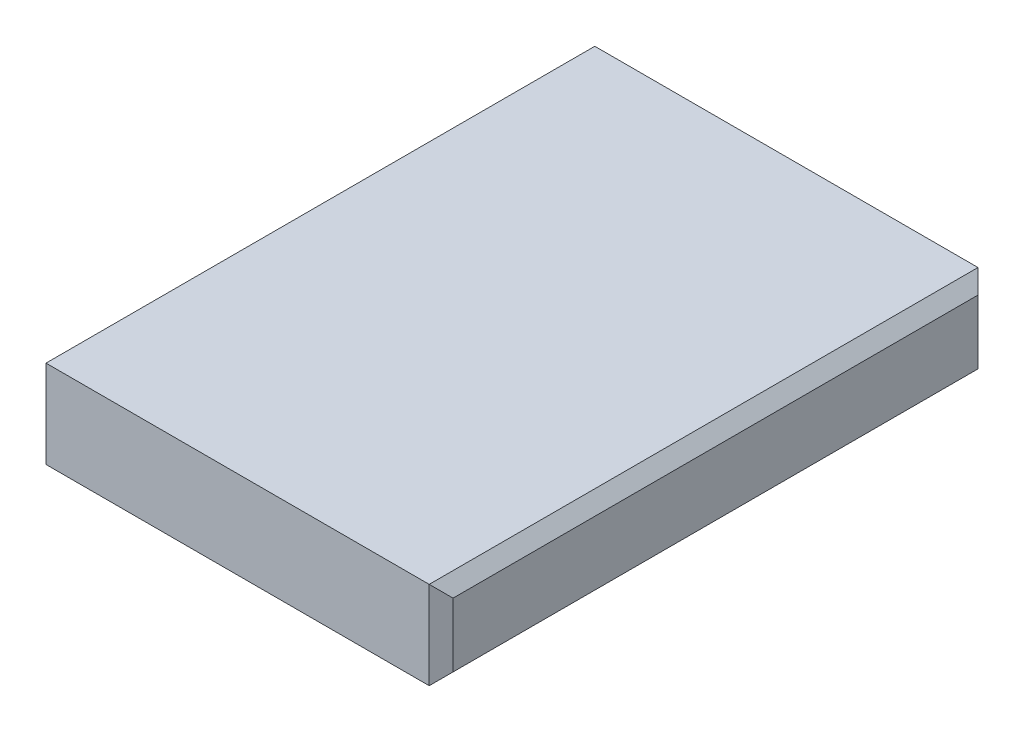
ISO-10303-21;
HEADER;
FILE_DESCRIPTION(('STEP AP214'),'2;1');
FILE_NAME('part.step','',(''),(''),'','','');
FILE_SCHEMA(('AUTOMOTIVE_DESIGN { 1 0 10303 214 1 1 1 1 }'));
ENDSEC;
DATA;
#1=APPLICATION_CONTEXT('core data for automotive mechanical design processes');
#2=APPLICATION_PROTOCOL_DEFINITION('international standard','automotive_design',2000,#1);
#3=PRODUCT_CONTEXT('',#1,'mechanical');
#4=PRODUCT('Part','Part','',(#3));
#5=PRODUCT_RELATED_PRODUCT_CATEGORY('part','',(#4));
#6=PRODUCT_DEFINITION_FORMATION('','',#4);
#7=PRODUCT_DEFINITION_CONTEXT('part definition',#1,'design');
#8=PRODUCT_DEFINITION('design','',#6,#7);
#9=PRODUCT_DEFINITION_SHAPE('','',#8);
#10=(LENGTH_UNIT() NAMED_UNIT(*) SI_UNIT(.MILLI.,.METRE.));
#11=(NAMED_UNIT(*) PLANE_ANGLE_UNIT() SI_UNIT($,.RADIAN.));
#12=(NAMED_UNIT(*) SI_UNIT($,.STERADIAN.) SOLID_ANGLE_UNIT());
#13=UNCERTAINTY_MEASURE_WITH_UNIT(LENGTH_MEASURE(1.E-05),#10,'distance_accuracy_value','');
#14=(GEOMETRIC_REPRESENTATION_CONTEXT(3) GLOBAL_UNCERTAINTY_ASSIGNED_CONTEXT((#13)) GLOBAL_UNIT_ASSIGNED_CONTEXT((#10,
#11,#12)) REPRESENTATION_CONTEXT('',''));
#15=CARTESIAN_POINT('',(0.,0.,0.));
#16=DIRECTION('',(0.,0.,1.));
#17=DIRECTION('',(1.,0.,0.));
#18=AXIS2_PLACEMENT_3D('',#15,#16,#17);
#19=CARTESIAN_POINT('',(35.4900000000119,15.85,-25.0210316449339));
#20=CARTESIAN_POINT('',(35.4900000000119,15.85,-12.9863304920074));
#21=CARTESIAN_POINT('',(35.4900000000119,12.507797657098,-25.0210316449339));
#22=CARTESIAN_POINT('',(35.4900000000119,12.507797657098,-12.9863304920074));
#23=(BOUNDED_SURFACE() B_SPLINE_SURFACE(1,1,((#19,#20),(#21,#22)),.UNSPECIFIED.,.F.,.F.,
.F.) B_SPLINE_SURFACE_WITH_KNOTS((2,2),(2,2),(0.,1.),(52.1634026604307,64.1981038133572),
.UNSPECIFIED.) GEOMETRIC_REPRESENTATION_ITEM() RATIONAL_B_SPLINE_SURFACE(((1.,1.),(1.,1.))) REPRESENTATION_ITEM('') SURFACE());
#24=CARTESIAN_POINT('',(35.4900000000119,15.125,-24.7499999999693));
#25=CARTESIAN_POINT('',(35.4900000000119,15.125,-13.2499999999696));
#26=(BOUNDED_CURVE() B_SPLINE_CURVE(1,(#24,#25),.UNSPECIFIED.,.F.,
.F.) B_SPLINE_CURVE_WITH_KNOTS((2,2),(0.,1.),
.UNSPECIFIED.) CURVE() GEOMETRIC_REPRESENTATION_ITEM() RATIONAL_B_SPLINE_CURVE((1.,1.)) REPRESENTATION_ITEM(''));
#27=CARTESIAN_POINT('',(35.4900000000119,15.125,-24.7499999999694));
#28=VERTEX_POINT('',#27);
#29=CARTESIAN_POINT('',(35.4900000000119,15.125,-13.2499999999696));
#30=VERTEX_POINT('',#29);
#31=EDGE_CURVE('E46',#28,#30,#26,.T.);
#32=CARTESIAN_POINT('',(35.4900000000119,13.285,-24.7499999999693));
#33=CARTESIAN_POINT('',(35.4900000000119,15.125,-24.7499999999693));
#34=(BOUNDED_CURVE() B_SPLINE_CURVE(1,(#32,#33),.UNSPECIFIED.,.F.,
.F.) B_SPLINE_CURVE_WITH_KNOTS((2,2),(0.,1.),
.UNSPECIFIED.) CURVE() GEOMETRIC_REPRESENTATION_ITEM() RATIONAL_B_SPLINE_CURVE((1.,1.)) REPRESENTATION_ITEM(''));
#35=CARTESIAN_POINT('',(35.4900000000119,13.285,-24.7499999999693));
#36=VERTEX_POINT('',#35);
#37=EDGE_CURVE('E11',#36,#28,#34,.T.);
#38=CARTESIAN_POINT('',(35.4900000000119,13.285,-13.2499999999696));
#39=CARTESIAN_POINT('',(35.4900000000119,13.285,-24.7499999999693));
#40=(BOUNDED_CURVE() B_SPLINE_CURVE(1,(#38,#39),.UNSPECIFIED.,.F.,
.F.) B_SPLINE_CURVE_WITH_KNOTS((2,2),(0.,1.),
.UNSPECIFIED.) CURVE() GEOMETRIC_REPRESENTATION_ITEM() RATIONAL_B_SPLINE_CURVE((1.,1.)) REPRESENTATION_ITEM(''));
#41=CARTESIAN_POINT('',(35.4900000000119,13.285,-13.2499999999696));
#42=VERTEX_POINT('',#41);
#43=EDGE_CURVE('E196',#42,#36,#40,.T.);
#44=CARTESIAN_POINT('',(35.4900000000119,15.125,-13.2499999999696));
#45=CARTESIAN_POINT('',(35.4900000000119,13.285,-13.2499999999696));
#46=(BOUNDED_CURVE() B_SPLINE_CURVE(1,(#44,#45),.UNSPECIFIED.,.F.,
.F.) B_SPLINE_CURVE_WITH_KNOTS((2,2),(0.,1.),
.UNSPECIFIED.) CURVE() GEOMETRIC_REPRESENTATION_ITEM() RATIONAL_B_SPLINE_CURVE((1.,1.)) REPRESENTATION_ITEM(''));
#47=EDGE_CURVE('E139',#30,#42,#46,.T.);
#48=ORIENTED_EDGE('',*,*,#31,.F.);
#49=ORIENTED_EDGE('',*,*,#37,.F.);
#50=ORIENTED_EDGE('',*,*,#43,.F.);
#51=ORIENTED_EDGE('',*,*,#47,.F.);
#52=EDGE_LOOP('',(#48,#49,#50,#51));
#53=FACE_BOUND('',#52,.T.);
#54=ADVANCED_FACE('F17',(#53),#23,.T.);
#55=CARTESIAN_POINT('',(43.5200000000117,13.285,-24.7499999999693));
#56=CARTESIAN_POINT('',(43.5200000000117,15.125,-24.7499999999693));
#57=CARTESIAN_POINT('',(35.4900000000119,13.285,-24.7499999999693));
#58=CARTESIAN_POINT('',(35.4900000000119,15.125,-24.7499999999693));
#59=(BOUNDED_SURFACE() B_SPLINE_SURFACE(1,1,((#55,#56),(#57,#58)),.UNSPECIFIED.,.F.,.F.,
.F.) B_SPLINE_SURFACE_WITH_KNOTS((2,2),(2,2),(0.0196217877432337,0.649873610055907),
(11.4999999999997,13.3399999999997),
.UNSPECIFIED.) GEOMETRIC_REPRESENTATION_ITEM() RATIONAL_B_SPLINE_SURFACE(((1.,1.),(1.,1.))) REPRESENTATION_ITEM('') SURFACE());
#60=CARTESIAN_POINT('',(43.5200000000117,15.125,-24.7499999999693));
#61=CARTESIAN_POINT('',(35.4900000000119,15.125,-24.7499999999693));
#62=(BOUNDED_CURVE() B_SPLINE_CURVE(1,(#60,#61),.UNSPECIFIED.,.F.,
.F.) B_SPLINE_CURVE_WITH_KNOTS((2,2),(0.0196217877432337,0.649873610055907),
.UNSPECIFIED.) CURVE() GEOMETRIC_REPRESENTATION_ITEM() RATIONAL_B_SPLINE_CURVE((1.,1.)) REPRESENTATION_ITEM(''));
#63=CARTESIAN_POINT('',(43.5200000000118,15.125,-24.7499999999693));
#64=VERTEX_POINT('',#63);
#65=EDGE_CURVE('E148',#64,#28,#62,.T.);
#66=CARTESIAN_POINT('',(43.5200000000117,13.285,-24.7499999999693));
#67=CARTESIAN_POINT('',(43.5200000000117,15.125,-24.7499999999693));
#68=(BOUNDED_CURVE() B_SPLINE_CURVE(1,(#66,#67),.UNSPECIFIED.,.F.,
.F.) B_SPLINE_CURVE_WITH_KNOTS((2,2),(0.249999999999931,0.749999999999932),
.UNSPECIFIED.) CURVE() GEOMETRIC_REPRESENTATION_ITEM() RATIONAL_B_SPLINE_CURVE((1.,1.)) REPRESENTATION_ITEM(''));
#69=CARTESIAN_POINT('',(43.5200000000118,13.285,-24.7499999999693));
#70=VERTEX_POINT('',#69);
#71=EDGE_CURVE('E132',#70,#64,#68,.T.);
#72=CARTESIAN_POINT('',(43.5200000000117,13.285,-24.7499999999693));
#73=CARTESIAN_POINT('',(35.4900000000119,13.285,-24.7499999999693));
#74=(BOUNDED_CURVE() B_SPLINE_CURVE(1,(#72,#73),.UNSPECIFIED.,.F.,
.F.) B_SPLINE_CURVE_WITH_KNOTS((2,2),(0.0196217877432337,0.649873610055907),
.UNSPECIFIED.) CURVE() GEOMETRIC_REPRESENTATION_ITEM() RATIONAL_B_SPLINE_CURVE((1.,1.)) REPRESENTATION_ITEM(''));
#75=EDGE_CURVE('E32',#70,#36,#74,.T.);
#76=ORIENTED_EDGE('',*,*,#37,.T.);
#77=ORIENTED_EDGE('',*,*,#65,.F.);
#78=ORIENTED_EDGE('',*,*,#71,.F.);
#79=ORIENTED_EDGE('',*,*,#75,.T.);
#80=EDGE_LOOP('',(#76,#77,#78,#79));
#81=FACE_BOUND('',#80,.T.);
#82=ADVANCED_FACE('F259',(#81),#59,.T.);
#83=CARTESIAN_POINT('',(43.5200000000117,15.125,-24.7499999999693));
#84=CARTESIAN_POINT('',(43.5200000000117,15.125,-13.2499999999696));
#85=CARTESIAN_POINT('',(35.4900000000119,15.125,-24.7499999999693));
#86=CARTESIAN_POINT('',(35.4900000000119,15.125,-13.2499999999696));
#87=(BOUNDED_SURFACE() B_SPLINE_SURFACE(1,1,((#83,#84),(#85,#86)),.UNSPECIFIED.,.F.,.F.,
.F.) B_SPLINE_SURFACE_WITH_KNOTS((2,2),(2,2),(0.0196217877432337,0.649873610055907),
(13.3399999999998,24.8399999999995),
.UNSPECIFIED.) GEOMETRIC_REPRESENTATION_ITEM() RATIONAL_B_SPLINE_SURFACE(((1.,1.),(1.,1.))) REPRESENTATION_ITEM('') SURFACE());
#88=CARTESIAN_POINT('',(43.5200000000117,15.125,-13.2499999999696));
#89=CARTESIAN_POINT('',(35.4900000000119,15.125,-13.2499999999696));
#90=(BOUNDED_CURVE() B_SPLINE_CURVE(1,(#88,#89),.UNSPECIFIED.,.F.,
.F.) B_SPLINE_CURVE_WITH_KNOTS((2,2),(0.0196217877432337,0.649873610055907),
.UNSPECIFIED.) CURVE() GEOMETRIC_REPRESENTATION_ITEM() RATIONAL_B_SPLINE_CURVE((1.,1.)) REPRESENTATION_ITEM(''));
#91=CARTESIAN_POINT('',(43.5200000000118,15.125,-13.2499999999696));
#92=VERTEX_POINT('',#91);
#93=EDGE_CURVE('E23',#92,#30,#90,.T.);
#94=CARTESIAN_POINT('',(43.5200000000117,15.125,-24.7499999999693));
#95=CARTESIAN_POINT('',(43.5200000000117,15.125,-13.2499999999696));
#96=(BOUNDED_CURVE() B_SPLINE_CURVE(1,(#94,#95),.UNSPECIFIED.,.F.,
.F.) B_SPLINE_CURVE_WITH_KNOTS((2,2),(0.249999999999989,0.749999999999978),
.UNSPECIFIED.) CURVE() GEOMETRIC_REPRESENTATION_ITEM() RATIONAL_B_SPLINE_CURVE((1.,1.)) REPRESENTATION_ITEM(''));
#97=EDGE_CURVE('E100',#64,#92,#96,.T.);
#98=ORIENTED_EDGE('',*,*,#31,.T.);
#99=ORIENTED_EDGE('',*,*,#93,.F.);
#100=ORIENTED_EDGE('',*,*,#97,.F.);
#101=ORIENTED_EDGE('',*,*,#65,.T.);
#102=EDGE_LOOP('',(#98,#99,#100,#101));
#103=FACE_BOUND('',#102,.T.);
#104=ADVANCED_FACE('F380',(#103),#87,.T.);
#105=CARTESIAN_POINT('',(43.5200000000117,15.125,-13.2499999999696));
#106=CARTESIAN_POINT('',(43.5200000000117,13.285,-13.2499999999696));
#107=CARTESIAN_POINT('',(35.4900000000119,15.125,-13.2499999999696));
#108=CARTESIAN_POINT('',(35.4900000000119,13.285,-13.2499999999696));
#109=(BOUNDED_SURFACE() B_SPLINE_SURFACE(1,1,((#105,#106),(#107,#108)),.UNSPECIFIED.,.F.,.F.,
.F.) B_SPLINE_SURFACE_WITH_KNOTS((2,2),(2,2),(0.0196217877432337,0.649873610055907),
(24.8399999999995,26.6799999999995),
.UNSPECIFIED.) GEOMETRIC_REPRESENTATION_ITEM() RATIONAL_B_SPLINE_SURFACE(((1.,1.),(1.,1.))) REPRESENTATION_ITEM('') SURFACE());
#110=CARTESIAN_POINT('',(43.5200000000117,13.285,-13.2499999999696));
#111=CARTESIAN_POINT('',(35.4900000000119,13.285,-13.2499999999696));
#112=(BOUNDED_CURVE() B_SPLINE_CURVE(1,(#110,#111),.UNSPECIFIED.,.F.,
.F.) B_SPLINE_CURVE_WITH_KNOTS((2,2),(0.0196217877432337,0.649873610055907),
.UNSPECIFIED.) CURVE() GEOMETRIC_REPRESENTATION_ITEM() RATIONAL_B_SPLINE_CURVE((1.,1.)) REPRESENTATION_ITEM(''));
#113=CARTESIAN_POINT('',(43.5200000000118,13.285,-13.2499999999696));
#114=VERTEX_POINT('',#113);
#115=EDGE_CURVE('E187',#114,#42,#112,.T.);
#116=CARTESIAN_POINT('',(43.5200000000117,15.125,-13.2499999999696));
#117=CARTESIAN_POINT('',(43.5200000000117,13.285,-13.2499999999696));
#118=(BOUNDED_CURVE() B_SPLINE_CURVE(1,(#116,#117),.UNSPECIFIED.,.F.,
.F.) B_SPLINE_CURVE_WITH_KNOTS((2,2),(0.249999999999863,0.749999999999864),
.UNSPECIFIED.) CURVE() GEOMETRIC_REPRESENTATION_ITEM() RATIONAL_B_SPLINE_CURVE((1.,1.)) REPRESENTATION_ITEM(''));
#119=EDGE_CURVE('E70',#92,#114,#118,.T.);
#120=ORIENTED_EDGE('',*,*,#47,.T.);
#121=ORIENTED_EDGE('',*,*,#115,.F.);
#122=ORIENTED_EDGE('',*,*,#119,.F.);
#123=ORIENTED_EDGE('',*,*,#93,.T.);
#124=EDGE_LOOP('',(#120,#121,#122,#123));
#125=FACE_BOUND('',#124,.T.);
#126=ADVANCED_FACE('F275',(#125),#109,.T.);
#127=CARTESIAN_POINT('',(43.5200000000117,13.285,-13.2499999999696));
#128=CARTESIAN_POINT('',(43.5200000000117,13.285,-24.7499999999693));
#129=CARTESIAN_POINT('',(35.4900000000119,13.285,-13.2499999999696));
#130=CARTESIAN_POINT('',(35.4900000000119,13.285,-24.7499999999693));
#131=(BOUNDED_SURFACE() B_SPLINE_SURFACE(1,1,((#127,#128),(#129,#130)),.UNSPECIFIED.,.F.,.F.,
.F.) B_SPLINE_SURFACE_WITH_KNOTS((2,2),(2,2),(0.0196217877432337,0.649873610055907),(0.,
11.4999999999997),.UNSPECIFIED.) GEOMETRIC_REPRESENTATION_ITEM() RATIONAL_B_SPLINE_SURFACE(((1.,
1.),(1.,1.))) REPRESENTATION_ITEM('') SURFACE());
#132=CARTESIAN_POINT('',(43.5200000000117,13.285,-13.2499999999696));
#133=CARTESIAN_POINT('',(43.5200000000117,13.285,-24.7499999999693));
#134=(BOUNDED_CURVE() B_SPLINE_CURVE(1,(#132,#133),.UNSPECIFIED.,.F.,
.F.) B_SPLINE_CURVE_WITH_KNOTS((2,2),(0.25,0.749999999999989),
.UNSPECIFIED.) CURVE() GEOMETRIC_REPRESENTATION_ITEM() RATIONAL_B_SPLINE_CURVE((1.,1.)) REPRESENTATION_ITEM(''));
#135=EDGE_CURVE('E197',#114,#70,#134,.T.);
#136=ORIENTED_EDGE('',*,*,#43,.T.);
#137=ORIENTED_EDGE('',*,*,#75,.F.);
#138=ORIENTED_EDGE('',*,*,#135,.F.);
#139=ORIENTED_EDGE('',*,*,#115,.T.);
#140=EDGE_LOOP('',(#136,#137,#138,#139));
#141=FACE_BOUND('',#140,.T.);
#142=ADVANCED_FACE('F262',(#141),#131,.T.);
#143=CARTESIAN_POINT('',(43.5200000000117,13.285,-13.2499999999696));
#144=CARTESIAN_POINT('',(43.7700000000117,13.535,-13.2499999999695));
#145=CARTESIAN_POINT('',(43.5200000000117,13.285,-24.7499999999693));
#146=CARTESIAN_POINT('',(43.7700000000117,13.535,-24.7499999999693));
#147=(BOUNDED_SURFACE() B_SPLINE_SURFACE(1,1,((#143,#144),(#145,#146)),.UNSPECIFIED.,.F.,.F.,
.F.) B_SPLINE_SURFACE_WITH_KNOTS((2,2),(2,2),(0.25,0.749999999999989),(0.,1.),
.UNSPECIFIED.) GEOMETRIC_REPRESENTATION_ITEM() RATIONAL_B_SPLINE_SURFACE(((1.,1.),(1.,1.))) REPRESENTATION_ITEM('') SURFACE());
#148=CARTESIAN_POINT('',(43.7700000000117,13.535,-13.4999999999696));
#149=CARTESIAN_POINT('',(43.7700000000117,13.535,-24.4999999999693));
#150=(BOUNDED_CURVE() B_SPLINE_CURVE(1,(#148,#149),.UNSPECIFIED.,.F.,
.F.) B_SPLINE_CURVE_WITH_KNOTS((2,2),(0.260869565217394,0.739130434782606),
.UNSPECIFIED.) CURVE() GEOMETRIC_REPRESENTATION_ITEM() RATIONAL_B_SPLINE_CURVE((1.,1.)) REPRESENTATION_ITEM(''));
#151=CARTESIAN_POINT('',(43.7700000000117,13.535,-13.4999999999696));
#152=VERTEX_POINT('',#151);
#153=CARTESIAN_POINT('',(43.7700000000117,13.535,-24.4999999999693));
#154=VERTEX_POINT('',#153);
#155=EDGE_CURVE('E83',#152,#154,#150,.T.);
#156=CARTESIAN_POINT('',(43.5200000000117,13.285,-13.2499999999696));
#157=CARTESIAN_POINT('',(43.6118232670147,13.3768232670029,-13.3418232669725));
#158=CARTESIAN_POINT('',(43.6781767330088,13.4431767329971,-13.4081767329667));
#159=CARTESIAN_POINT('',(43.7700000000117,13.535,-13.4999999999696));
#160=(BOUNDED_CURVE() B_SPLINE_CURVE(3,(#156,#157,#158,#159),.UNSPECIFIED.,.F.,
.F.) B_SPLINE_CURVE_WITH_KNOTS((4,4),(0.,0.477127691298124),
.UNSPECIFIED.) CURVE() GEOMETRIC_REPRESENTATION_ITEM() RATIONAL_B_SPLINE_CURVE((1.,1.,1.,1.)) REPRESENTATION_ITEM(''));
#161=EDGE_CURVE('E86',#114,#152,#160,.T.);
#162=CARTESIAN_POINT('',(43.5200000000117,13.285,-24.7499999999694));
#163=CARTESIAN_POINT('',(43.6118232670148,13.376823267003,-24.6581767329664));
#164=CARTESIAN_POINT('',(43.6781767330088,13.443176732997,-24.5918232669723));
#165=CARTESIAN_POINT('',(43.7700000000117,13.535,-24.4999999999693));
#166=(BOUNDED_CURVE() B_SPLINE_CURVE(3,(#162,#163,#164,#165),.UNSPECIFIED.,.F.,
.F.) B_SPLINE_CURVE_WITH_KNOTS((4,4),(0.,0.477127691298447),
.UNSPECIFIED.) CURVE() GEOMETRIC_REPRESENTATION_ITEM() RATIONAL_B_SPLINE_CURVE((1.,1.,1.,1.)) REPRESENTATION_ITEM(''));
#167=EDGE_CURVE('E88',#70,#154,#166,.T.);
#168=ORIENTED_EDGE('',*,*,#155,.F.);
#169=ORIENTED_EDGE('',*,*,#161,.F.);
#170=ORIENTED_EDGE('',*,*,#135,.T.);
#171=ORIENTED_EDGE('',*,*,#167,.T.);
#172=EDGE_LOOP('',(#168,#169,#170,#171));
#173=FACE_BOUND('',#172,.T.);
#174=ADVANCED_FACE('F84',(#173),#147,.T.);
#175=CARTESIAN_POINT('',(43.5200000000117,15.125,-13.2499999999696));
#176=CARTESIAN_POINT('',(43.7700000000117,15.1250000000005,-13.4999999999696));
#177=CARTESIAN_POINT('',(43.5200000000117,13.285,-13.2499999999696));
#178=CARTESIAN_POINT('',(43.7700000000117,13.2850000000005,-13.4999999999696));
#179=(BOUNDED_SURFACE() B_SPLINE_SURFACE(1,1,((#175,#176),(#177,#178)),.UNSPECIFIED.,.F.,.F.,
.F.) B_SPLINE_SURFACE_WITH_KNOTS((2,2),(2,2),(0.249999999999863,0.749999999999864),(0.,1.),
.UNSPECIFIED.) GEOMETRIC_REPRESENTATION_ITEM() RATIONAL_B_SPLINE_SURFACE(((1.,1.),(1.,1.))) REPRESENTATION_ITEM('') SURFACE());
#180=CARTESIAN_POINT('',(43.7700000000117,14.875,-13.4999999999696));
#181=CARTESIAN_POINT('',(43.7700000000117,13.535,-13.4999999999696));
#182=(BOUNDED_CURVE() B_SPLINE_CURVE(1,(#180,#181),.UNSPECIFIED.,.F.,
.F.) B_SPLINE_CURVE_WITH_KNOTS((2,2),(0.317934782608694,0.682065217391305),
.UNSPECIFIED.) CURVE() GEOMETRIC_REPRESENTATION_ITEM() RATIONAL_B_SPLINE_CURVE((1.,1.)) REPRESENTATION_ITEM(''));
#183=CARTESIAN_POINT('',(43.7700000000117,14.875,-13.4999999999696));
#184=VERTEX_POINT('',#183);
#185=EDGE_CURVE('E94',#184,#152,#182,.T.);
#186=CARTESIAN_POINT('',(43.5200000000117,15.125,-13.2499999999696));
#187=CARTESIAN_POINT('',(43.6118232670148,15.033176732997,-13.3418232669726));
#188=CARTESIAN_POINT('',(43.6781767330088,14.966823267003,-13.4081767329666));
#189=CARTESIAN_POINT('',(43.7700000000117,14.875,-13.4999999999696));
#190=(BOUNDED_CURVE() B_SPLINE_CURVE(3,(#186,#187,#188,#189),.UNSPECIFIED.,.F.,
.F.) B_SPLINE_CURVE_WITH_KNOTS((4,4),(0.,0.47712769129844),
.UNSPECIFIED.) CURVE() GEOMETRIC_REPRESENTATION_ITEM() RATIONAL_B_SPLINE_CURVE((1.,1.,1.,1.)) REPRESENTATION_ITEM(''));
#191=EDGE_CURVE('E125',#92,#184,#190,.T.);
#192=ORIENTED_EDGE('',*,*,#185,.F.);
#193=ORIENTED_EDGE('',*,*,#191,.F.);
#194=ORIENTED_EDGE('',*,*,#119,.T.);
#195=ORIENTED_EDGE('',*,*,#161,.T.);
#196=EDGE_LOOP('',(#192,#193,#194,#195));
#197=FACE_BOUND('',#196,.T.);
#198=ADVANCED_FACE('F19',(#197),#179,.T.);
#199=CARTESIAN_POINT('',(43.5200000000117,15.125,-24.7499999999693));
#200=CARTESIAN_POINT('',(43.7700000000117,14.875,-24.7499999999696));
#201=CARTESIAN_POINT('',(43.5200000000117,15.125,-13.2499999999696));
#202=CARTESIAN_POINT('',(43.7700000000117,14.875,-13.2499999999699));
#203=(BOUNDED_SURFACE() B_SPLINE_SURFACE(1,1,((#199,#200),(#201,#202)),.UNSPECIFIED.,.F.,.F.,
.F.) B_SPLINE_SURFACE_WITH_KNOTS((2,2),(2,2),(0.249999999999989,0.749999999999978),(0.,1.),
.UNSPECIFIED.) GEOMETRIC_REPRESENTATION_ITEM() RATIONAL_B_SPLINE_SURFACE(((1.,1.),(1.,1.))) REPRESENTATION_ITEM('') SURFACE());
#204=CARTESIAN_POINT('',(43.7700000000117,14.875,-24.4999999999693));
#205=CARTESIAN_POINT('',(43.7700000000117,14.875,-13.4999999999696));
#206=(BOUNDED_CURVE() B_SPLINE_CURVE(1,(#204,#205),.UNSPECIFIED.,.F.,
.F.) B_SPLINE_CURVE_WITH_KNOTS((2,2),(0.260869565217394,0.739130434782606),
.UNSPECIFIED.) CURVE() GEOMETRIC_REPRESENTATION_ITEM() RATIONAL_B_SPLINE_CURVE((1.,1.)) REPRESENTATION_ITEM(''));
#207=CARTESIAN_POINT('',(43.7700000000117,14.875,-24.4999999999693));
#208=VERTEX_POINT('',#207);
#209=EDGE_CURVE('E105',#208,#184,#206,.T.);
#210=CARTESIAN_POINT('',(43.5200000000117,15.125,-24.7499999999694));
#211=CARTESIAN_POINT('',(43.6118232670148,15.033176732997,-24.6581767329664));
#212=CARTESIAN_POINT('',(43.6781767330088,14.966823267003,-24.5918232669723));
#213=CARTESIAN_POINT('',(43.7700000000117,14.875,-24.4999999999693));
#214=(BOUNDED_CURVE() B_SPLINE_CURVE(3,(#210,#211,#212,#213),.UNSPECIFIED.,.F.,
.F.) B_SPLINE_CURVE_WITH_KNOTS((4,4),(0.,0.477127691298427),
.UNSPECIFIED.) CURVE() GEOMETRIC_REPRESENTATION_ITEM() RATIONAL_B_SPLINE_CURVE((1.,1.,1.,1.)) REPRESENTATION_ITEM(''));
#215=EDGE_CURVE('E112',#64,#208,#214,.T.);
#216=ORIENTED_EDGE('',*,*,#209,.F.);
#217=ORIENTED_EDGE('',*,*,#215,.F.);
#218=ORIENTED_EDGE('',*,*,#97,.T.);
#219=ORIENTED_EDGE('',*,*,#191,.T.);
#220=EDGE_LOOP('',(#216,#217,#218,#219));
#221=FACE_BOUND('',#220,.T.);
#222=ADVANCED_FACE('F340',(#221),#203,.T.);
#223=CARTESIAN_POINT('',(43.5200000000117,13.285,-24.7499999999693));
#224=CARTESIAN_POINT('',(43.7700000000117,13.2849999999997,-24.4999999999693));
#225=CARTESIAN_POINT('',(43.5200000000117,15.125,-24.7499999999693));
#226=CARTESIAN_POINT('',(43.7700000000117,15.125,-24.4999999999693));
#227=(BOUNDED_SURFACE() B_SPLINE_SURFACE(1,1,((#223,#224),(#225,#226)),.UNSPECIFIED.,.F.,.F.,
.F.) B_SPLINE_SURFACE_WITH_KNOTS((2,2),(2,2),(0.249999999999931,0.749999999999932),(0.,1.),
.UNSPECIFIED.) GEOMETRIC_REPRESENTATION_ITEM() RATIONAL_B_SPLINE_SURFACE(((1.,1.),(1.,1.))) REPRESENTATION_ITEM('') SURFACE());
#228=CARTESIAN_POINT('',(43.7700000000117,13.535,-24.4999999999693));
#229=CARTESIAN_POINT('',(43.7700000000117,14.875,-24.4999999999693));
#230=(BOUNDED_CURVE() B_SPLINE_CURVE(1,(#228,#229),.UNSPECIFIED.,.F.,
.F.) B_SPLINE_CURVE_WITH_KNOTS((2,2),(0.317934782608695,0.682065217391307),
.UNSPECIFIED.) CURVE() GEOMETRIC_REPRESENTATION_ITEM() RATIONAL_B_SPLINE_CURVE((1.,1.)) REPRESENTATION_ITEM(''));
#231=EDGE_CURVE('E95',#154,#208,#230,.T.);
#232=ORIENTED_EDGE('',*,*,#231,.F.);
#233=ORIENTED_EDGE('',*,*,#167,.F.);
#234=ORIENTED_EDGE('',*,*,#71,.T.);
#235=ORIENTED_EDGE('',*,*,#215,.T.);
#236=EDGE_LOOP('',(#232,#233,#234,#235));
#237=FACE_BOUND('',#236,.T.);
#238=ADVANCED_FACE('F172',(#237),#227,.T.);
#239=CARTESIAN_POINT('',(43.7700000000117,13.535,-24.4999999999693));
#240=CARTESIAN_POINT('',(43.7700000000117,13.535,-13.4999999999696));
#241=CARTESIAN_POINT('',(43.7700000000117,14.875,-24.4999999999693));
#242=CARTESIAN_POINT('',(43.7700000000117,14.875,-13.4999999999696));
#243=(BOUNDED_SURFACE() B_SPLINE_SURFACE(1,1,((#239,#240),(#241,#242)),.UNSPECIFIED.,.F.,.F.,
.F.) B_SPLINE_SURFACE_WITH_KNOTS((2,2),(2,2),(0.472605166733573,0.527394833266427),
(0.275117040350233,0.724882959649767),
.UNSPECIFIED.) GEOMETRIC_REPRESENTATION_ITEM() RATIONAL_B_SPLINE_SURFACE(((1.,1.),(1.,1.))) REPRESENTATION_ITEM('') SURFACE());
#244=ORIENTED_EDGE('',*,*,#209,.T.);
#245=ORIENTED_EDGE('',*,*,#185,.T.);
#246=ORIENTED_EDGE('',*,*,#155,.T.);
#247=ORIENTED_EDGE('',*,*,#231,.T.);
#248=EDGE_LOOP('',(#244,#245,#246,#247));
#249=FACE_BOUND('',#248,.T.);
#250=ADVANCED_FACE('F103',(#249),#243,.T.);
#251=CLOSED_SHELL('',(#54,#82,#104,#126,#142,#174,#198,#222,#238,#250));
#252=MANIFOLD_SOLID_BREP('B1',#251);
#253=ADVANCED_BREP_SHAPE_REPRESENTATION('',(#18,#252),#14);
#254=SHAPE_DEFINITION_REPRESENTATION(#9,#253);
ENDSEC;
END-ISO-10303-21;
